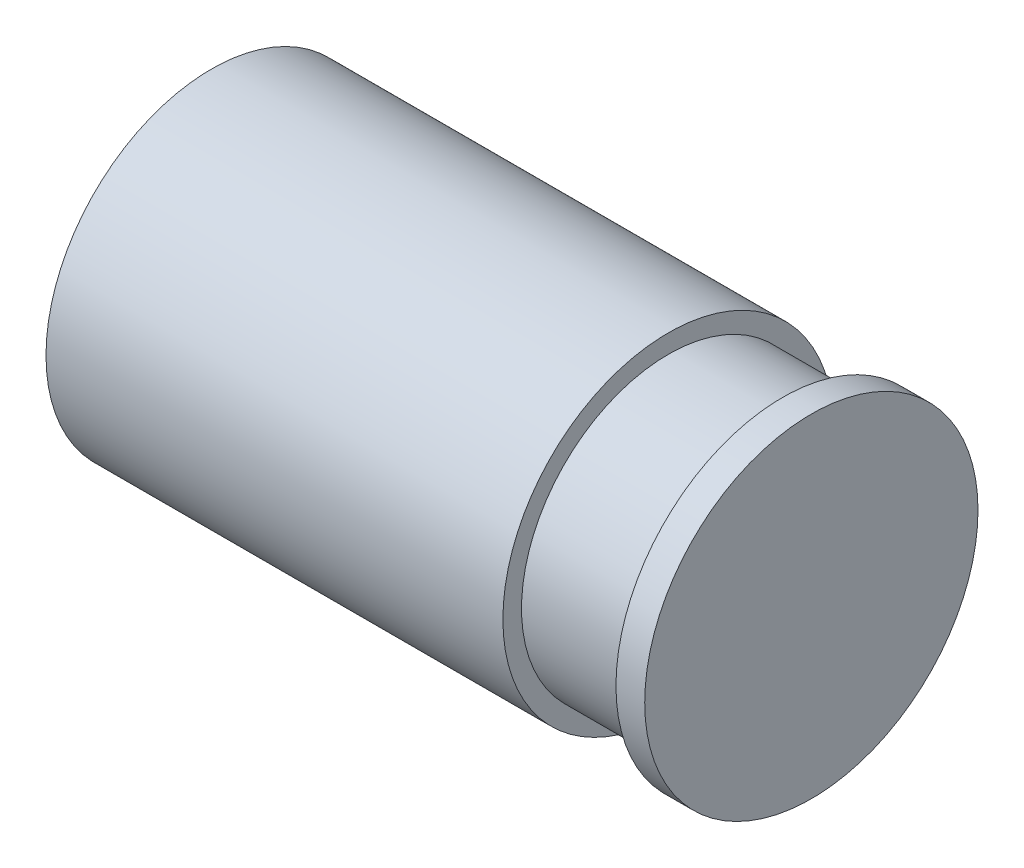
ISO-10303-21;
HEADER;
FILE_DESCRIPTION(('STEP AP214'),'2;1');
FILE_NAME('part.step','',(''),(''),'','','');
FILE_SCHEMA(('AUTOMOTIVE_DESIGN { 1 0 10303 214 1 1 1 1 }'));
ENDSEC;
DATA;
#1=APPLICATION_CONTEXT('core data for automotive mechanical design processes');
#2=APPLICATION_PROTOCOL_DEFINITION('international standard','automotive_design',2000,#1);
#3=PRODUCT_CONTEXT('',#1,'mechanical');
#4=PRODUCT('Part','Part','',(#3));
#5=PRODUCT_RELATED_PRODUCT_CATEGORY('part','',(#4));
#6=PRODUCT_DEFINITION_FORMATION('','',#4);
#7=PRODUCT_DEFINITION_CONTEXT('part definition',#1,'design');
#8=PRODUCT_DEFINITION('design','',#6,#7);
#9=PRODUCT_DEFINITION_SHAPE('','',#8);
#10=(LENGTH_UNIT() NAMED_UNIT(*) SI_UNIT(.MILLI.,.METRE.));
#11=(NAMED_UNIT(*) PLANE_ANGLE_UNIT() SI_UNIT($,.RADIAN.));
#12=(NAMED_UNIT(*) SI_UNIT($,.STERADIAN.) SOLID_ANGLE_UNIT());
#13=UNCERTAINTY_MEASURE_WITH_UNIT(LENGTH_MEASURE(1.E-05),#10,'distance_accuracy_value','');
#14=(GEOMETRIC_REPRESENTATION_CONTEXT(3) GLOBAL_UNCERTAINTY_ASSIGNED_CONTEXT((#13)) GLOBAL_UNIT_ASSIGNED_CONTEXT((#10,
#11,#12)) REPRESENTATION_CONTEXT('',''));
#15=CARTESIAN_POINT('',(0.,0.,0.));
#16=DIRECTION('',(0.,0.,1.));
#17=DIRECTION('',(1.,0.,0.));
#18=AXIS2_PLACEMENT_3D('',#15,#16,#17);
#19=CARTESIAN_POINT('',(0.,0.,0.));
#20=DIRECTION('',(-1.,0.,0.));
#21=DIRECTION('',(0.,0.,1.));
#22=AXIS2_PLACEMENT_3D('',#19,#20,#21);
#23=PLANE('',#22);
#24=CARTESIAN_POINT('',(0.,0.,0.));
#25=DIRECTION('',(1.,0.,0.));
#26=DIRECTION('',(0.,0.,-1.));
#27=AXIS2_PLACEMENT_3D('',#24,#25,#26);
#28=CIRCLE('',#27,24.8206125452783);
#29=CARTESIAN_POINT('',(0.,0.,-24.8206125452783));
#30=VERTEX_POINT('',#29);
#31=EDGE_CURVE('E10',#30,#30,#28,.T.);
#32=ORIENTED_EDGE('',*,*,#31,.F.);
#33=EDGE_LOOP('',(#32));
#34=FACE_BOUND('',#33,.T.);
#35=ADVANCED_FACE('F39',(#34),#23,.T.);
#36=CARTESIAN_POINT('',(0.,0.,0.));
#37=DIRECTION('',(1.,0.,0.));
#38=DIRECTION('',(0.,0.,-1.));
#39=AXIS2_PLACEMENT_3D('',#36,#37,#38);
#40=CYLINDRICAL_SURFACE('',#39,24.8206125452783);
#41=ORIENTED_EDGE('',*,*,#31,.T.);
#42=EDGE_LOOP('',(#41));
#43=FACE_BOUND('',#42,.T.);
#44=CARTESIAN_POINT('',(68.5439639814402,0.,0.));
#45=DIRECTION('',(1.,0.,0.));
#46=DIRECTION('',(0.,0.,-1.));
#47=AXIS2_PLACEMENT_3D('',#44,#45,#46);
#48=CIRCLE('',#47,24.8206125452783);
#49=CARTESIAN_POINT('',(68.5439639814402,0.,-24.8206125452783));
#50=VERTEX_POINT('',#49);
#51=EDGE_CURVE('E46',#50,#50,#48,.T.);
#52=ORIENTED_EDGE('',*,*,#51,.F.);
#53=EDGE_LOOP('',(#52));
#54=FACE_BOUND('',#53,.T.);
#55=ADVANCED_FACE('F87',(#43,#54),#40,.T.);
#56=CARTESIAN_POINT('',(68.5439639814402,24.8206125452783,0.));
#57=DIRECTION('',(1.,0.,0.));
#58=DIRECTION('',(0.,0.,-1.));
#59=AXIS2_PLACEMENT_3D('',#56,#57,#58);
#60=PLANE('',#59);
#61=ORIENTED_EDGE('',*,*,#51,.T.);
#62=EDGE_LOOP('',(#61));
#63=FACE_BOUND('',#62,.T.);
#64=CARTESIAN_POINT('',(68.5439639814402,0.,0.));
#65=DIRECTION('',(1.,0.,0.));
#66=DIRECTION('',(0.,0.,-1.));
#67=AXIS2_PLACEMENT_3D('',#64,#65,#66);
#68=CIRCLE('',#67,22.0280593537889);
#69=CARTESIAN_POINT('',(68.5439639814402,0.,-22.0280593537889));
#70=VERTEX_POINT('',#69);
#71=EDGE_CURVE('E51',#70,#70,#68,.T.);
#72=ORIENTED_EDGE('',*,*,#71,.F.);
#73=EDGE_LOOP('',(#72));
#74=FACE_BOUND('',#73,.T.);
#75=ADVANCED_FACE('F92',(#63,#74),#60,.T.);
#76=CARTESIAN_POINT('',(0.,0.,0.));
#77=DIRECTION('',(1.,0.,0.));
#78=DIRECTION('',(0.,0.,-1.));
#79=AXIS2_PLACEMENT_3D('',#76,#77,#78);
#80=CYLINDRICAL_SURFACE('',#79,22.0280593537889);
#81=ORIENTED_EDGE('',*,*,#71,.T.);
#82=EDGE_LOOP('',(#81));
#83=FACE_BOUND('',#82,.T.);
#84=CARTESIAN_POINT('',(85.6844597546931,0.,0.));
#85=DIRECTION('',(1.,0.,0.));
#86=DIRECTION('',(0.,0.,-1.));
#87=AXIS2_PLACEMENT_3D('',#84,#85,#86);
#88=CIRCLE('',#87,22.0280593537889);
#89=CARTESIAN_POINT('',(85.6844597546931,0.,-22.0280593537889));
#90=VERTEX_POINT('',#89);
#91=EDGE_CURVE('E56',#90,#90,#88,.T.);
#92=ORIENTED_EDGE('',*,*,#91,.F.);
#93=EDGE_LOOP('',(#92));
#94=FACE_BOUND('',#93,.T.);
#95=ADVANCED_FACE('F83',(#83,#94),#80,.T.);
#96=CARTESIAN_POINT('',(85.6844597546931,22.0280593537889,0.));
#97=DIRECTION('',(-1.,0.,0.));
#98=DIRECTION('',(0.,0.,1.));
#99=AXIS2_PLACEMENT_3D('',#96,#97,#98);
#100=PLANE('',#99);
#101=ORIENTED_EDGE('',*,*,#91,.T.);
#102=EDGE_LOOP('',(#101));
#103=FACE_BOUND('',#102,.T.);
#104=CARTESIAN_POINT('',(85.6844597546931,0.,0.));
#105=DIRECTION('',(1.,0.,0.));
#106=DIRECTION('',(0.,0.,-1.));
#107=AXIS2_PLACEMENT_3D('',#104,#105,#106);
#108=CIRCLE('',#107,25.);
#109=CARTESIAN_POINT('',(85.6844597546931,0.,-25.));
#110=VERTEX_POINT('',#109);
#111=EDGE_CURVE('E62',#110,#110,#108,.T.);
#112=ORIENTED_EDGE('',*,*,#111,.F.);
#113=EDGE_LOOP('',(#112));
#114=FACE_BOUND('',#113,.T.);
#115=ADVANCED_FACE('F75',(#103,#114),#100,.T.);
#116=CARTESIAN_POINT('',(0.,0.,0.));
#117=DIRECTION('',(1.,0.,0.));
#118=DIRECTION('',(0.,0.,-1.));
#119=AXIS2_PLACEMENT_3D('',#116,#117,#118);
#120=CYLINDRICAL_SURFACE('',#119,25.);
#121=ORIENTED_EDGE('',*,*,#111,.T.);
#122=EDGE_LOOP('',(#121));
#123=FACE_BOUND('',#122,.T.);
#124=CARTESIAN_POINT('',(90.,0.,0.));
#125=DIRECTION('',(1.,0.,0.));
#126=DIRECTION('',(0.,0.,-1.));
#127=AXIS2_PLACEMENT_3D('',#124,#125,#126);
#128=CIRCLE('',#127,25.);
#129=CARTESIAN_POINT('',(90.,0.,-25.));
#130=VERTEX_POINT('',#129);
#131=EDGE_CURVE('E66',#130,#130,#128,.T.);
#132=ORIENTED_EDGE('',*,*,#131,.F.);
#133=EDGE_LOOP('',(#132));
#134=FACE_BOUND('',#133,.T.);
#135=ADVANCED_FACE('F73',(#123,#134),#120,.T.);
#136=CARTESIAN_POINT('',(90.,25.,0.));
#137=DIRECTION('',(1.,0.,0.));
#138=DIRECTION('',(0.,0.,-1.));
#139=AXIS2_PLACEMENT_3D('',#136,#137,#138);
#140=PLANE('',#139);
#141=ORIENTED_EDGE('',*,*,#131,.T.);
#142=EDGE_LOOP('',(#141));
#143=FACE_BOUND('',#142,.T.);
#144=ADVANCED_FACE('F71',(#143),#140,.T.);
#145=CLOSED_SHELL('',(#35,#55,#75,#95,#115,#135,#144));
#146=MANIFOLD_SOLID_BREP('B2',#145);
#147=ADVANCED_BREP_SHAPE_REPRESENTATION('',(#18,#146),#14);
#148=SHAPE_DEFINITION_REPRESENTATION(#9,#147);
ENDSEC;
END-ISO-10303-21;
